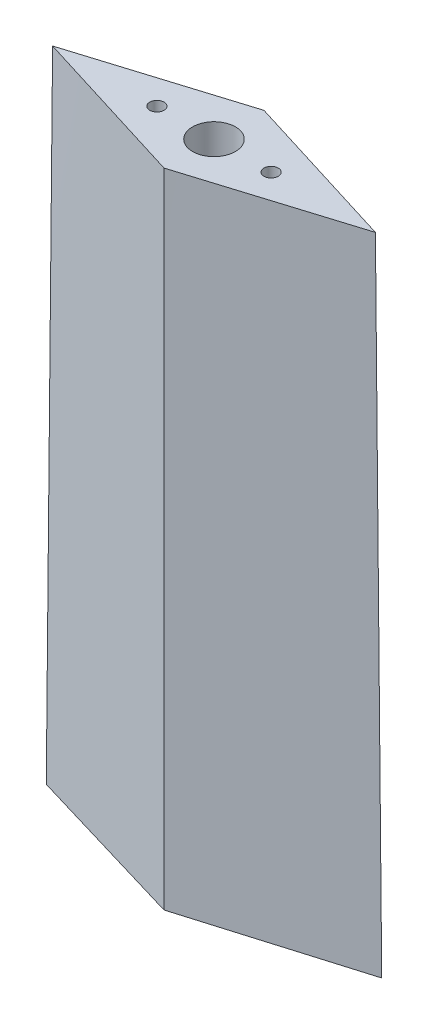
ISO-10303-21;
HEADER;
FILE_DESCRIPTION(('STEP AP214'),'2;1');
FILE_NAME('part.step','',(''),(''),'','','');
FILE_SCHEMA(('AUTOMOTIVE_DESIGN { 1 0 10303 214 1 1 1 1 }'));
ENDSEC;
DATA;
#1=APPLICATION_CONTEXT('core data for automotive mechanical design processes');
#2=APPLICATION_PROTOCOL_DEFINITION('international standard','automotive_design',2000,#1);
#3=PRODUCT_CONTEXT('',#1,'mechanical');
#4=PRODUCT('Part','Part','',(#3));
#5=PRODUCT_RELATED_PRODUCT_CATEGORY('part','',(#4));
#6=PRODUCT_DEFINITION_FORMATION('','',#4);
#7=PRODUCT_DEFINITION_CONTEXT('part definition',#1,'design');
#8=PRODUCT_DEFINITION('design','',#6,#7);
#9=PRODUCT_DEFINITION_SHAPE('','',#8);
#10=(LENGTH_UNIT() NAMED_UNIT(*) SI_UNIT(.MILLI.,.METRE.));
#11=(NAMED_UNIT(*) PLANE_ANGLE_UNIT() SI_UNIT($,.RADIAN.));
#12=(NAMED_UNIT(*) SI_UNIT($,.STERADIAN.) SOLID_ANGLE_UNIT());
#13=UNCERTAINTY_MEASURE_WITH_UNIT(LENGTH_MEASURE(1.E-05),#10,'distance_accuracy_value','');
#14=(GEOMETRIC_REPRESENTATION_CONTEXT(3) GLOBAL_UNCERTAINTY_ASSIGNED_CONTEXT((#13)) GLOBAL_UNIT_ASSIGNED_CONTEXT((#10,
#11,#12)) REPRESENTATION_CONTEXT('',''));
#15=CARTESIAN_POINT('',(0.,0.,0.));
#16=DIRECTION('',(0.,0.,1.));
#17=DIRECTION('',(1.,0.,0.));
#18=AXIS2_PLACEMENT_3D('',#15,#16,#17);
#19=CARTESIAN_POINT('',(219.716026671538,465.168027231046,0.));
#20=CARTESIAN_POINT('',(213.502471629307,1096.96763455169,0.));
#21=CARTESIAN_POINT('',(213.274793673085,465.168027231046,1.85208333333331));
#22=CARTESIAN_POINT('',(208.096831137892,1096.96763455169,1.85208333333331));
#23=CARTESIAN_POINT('',(206.833560674631,465.168027231046,3.70416666666664));
#24=CARTESIAN_POINT('',(202.691190646477,1096.96763455169,3.70416666666663));
#25=CARTESIAN_POINT('',(193.951094677724,465.168027231046,7.4083333333333));
#26=CARTESIAN_POINT('',(191.879909663647,1096.96763455169,7.4083333333333));
#27=CARTESIAN_POINT('',(187.509861679271,465.168027231046,9.26041666666665));
#28=CARTESIAN_POINT('',(186.474269172232,1096.96763455169,9.26041666666665));
#29=CARTESIAN_POINT('',(181.068628680817,465.168027231046,11.1125));
#30=CARTESIAN_POINT('',(181.068628680817,1096.96763455169,11.1125));
#31=B_SPLINE_SURFACE_WITH_KNOTS('',3,1,((#19,#20),(#21,#22),(#23,#24),(#25,#26),(#27,#28),(#29,
#30)),.UNSPECIFIED.,.F.,.F.,.F.,(4,2,4),(2,2),(0.,0.5,1.),(0.,1.),.UNSPECIFIED.);
#32=CARTESIAN_POINT('',(181.068628680817,745.712215652406,11.1125));
#33=CARTESIAN_POINT('',(184.269788718265,745.712215652406,10.1212895187487));
#34=CARTESIAN_POINT('',(187.470948755713,745.712215652406,9.13007903749738));
#35=CARTESIAN_POINT('',(193.873268830608,745.712215652406,7.14765807499477));
#36=CARTESIAN_POINT('',(197.074428868056,745.712215652406,6.15644759374346));
#37=CARTESIAN_POINT('',(205.836046191891,745.712215652406,3.44349140832811));
#38=CARTESIAN_POINT('',(211.396503478278,745.712215652406,1.72174570416407));
#39=CARTESIAN_POINT('',(216.956960764665,745.712215652406,0.));
#40=B_SPLINE_CURVE_WITH_KNOTS('',3,(#32,#33,#34,#35,#36,#37,#38,#39),.UNSPECIFIED.,.F.,.F.,(4,2,
2,4),(0.,10.0533235415682,20.1066470831364,37.5694029232634),.UNSPECIFIED.);
#41=CARTESIAN_POINT('',(181.068628680817,745.712215652406,11.1125));
#42=VERTEX_POINT('',#41);
#43=CARTESIAN_POINT('',(216.956960764665,745.712215652406,0.));
#44=VERTEX_POINT('',#43);
#45=EDGE_CURVE('E119',#42,#44,#40,.T.);
#46=DIRECTION('',(0.,1.,0.));
#47=VECTOR('',#46,1.);
#48=CARTESIAN_POINT('',(181.068628680817,781.067830891368,11.1125));
#49=LINE('',#48,#47);
#50=CARTESIAN_POINT('',(181.068628680817,602.837215652406,11.1125));
#51=VERTEX_POINT('',#50);
#52=EDGE_CURVE('E73',#51,#42,#49,.T.);
#53=CARTESIAN_POINT('',(218.362092496898,602.837215652406,0.));
#54=CARTESIAN_POINT('',(215.15052846194,602.837215652406,0.956964081279098));
#55=CARTESIAN_POINT('',(211.938964426982,602.837215652406,1.9139281625582));
#56=CARTESIAN_POINT('',(205.515836357066,602.837215652406,3.82785632511641));
#57=CARTESIAN_POINT('',(202.304272322108,602.837215652406,4.78482040639551));
#58=CARTESIAN_POINT('',(193.084681751706,602.837215652406,7.53202299178308));
#59=CARTESIAN_POINT('',(187.076655216262,602.837215652406,9.32226149589155));
#60=CARTESIAN_POINT('',(181.068628680818,602.837215652406,11.1125));
#61=B_SPLINE_CURVE_WITH_KNOTS('',3,(#53,#54,#55,#56,#57,#58,#59,#60),.UNSPECIFIED.,.F.,.F.,(4,2,
2,4),(0.,10.0533235415682,20.1066470831364,38.9138805524626),.UNSPECIFIED.);
#62=CARTESIAN_POINT('',(218.362092496898,602.837215652406,0.));
#63=VERTEX_POINT('',#62);
#64=EDGE_CURVE('E125',#63,#51,#61,.T.);
#65=DIRECTION('',(-0.00983421721197636,0.99995164291671,0.));
#66=VECTOR('',#65,1.);
#67=CARTESIAN_POINT('',(219.716026671538,465.168027231046,0.));
#68=LINE('',#67,#66);
#69=EDGE_CURVE('E12',#63,#44,#68,.T.);
#70=ORIENTED_EDGE('',*,*,#45,.F.);
#71=ORIENTED_EDGE('',*,*,#52,.F.);
#72=ORIENTED_EDGE('',*,*,#64,.F.);
#73=ORIENTED_EDGE('',*,*,#69,.T.);
#74=EDGE_LOOP('',(#70,#71,#72,#73));
#75=FACE_BOUND('',#74,.T.);
#76=ADVANCED_FACE('F61',(#75),#31,.F.);
#77=CARTESIAN_POINT('',(181.068628680817,465.168027231046,11.1125));
#78=CARTESIAN_POINT('',(181.068628680817,1096.96763455169,11.1125));
#79=CARTESIAN_POINT('',(174.627395682364,465.168027231046,9.26041666666668));
#80=CARTESIAN_POINT('',(175.662988189402,1096.96763455169,9.26041666666663));
#81=CARTESIAN_POINT('',(168.186162683911,465.168027231046,7.40833333333335));
#82=CARTESIAN_POINT('',(170.257347697988,1096.96763455169,7.40833333333328));
#83=CARTESIAN_POINT('',(155.303696687004,465.168027231046,3.70416666666668));
#84=CARTESIAN_POINT('',(159.446066715158,1096.96763455169,3.70416666666661));
#85=CARTESIAN_POINT('',(148.86246368855,465.168027231046,1.85208333333334));
#86=CARTESIAN_POINT('',(154.040426223743,1096.96763455169,1.8520833333333));
#87=CARTESIAN_POINT('',(142.421230690097,465.168027231046,0.));
#88=CARTESIAN_POINT('',(148.634785732328,1096.96763455169,0.));
#89=B_SPLINE_SURFACE_WITH_KNOTS('',3,1,((#77,#78),(#79,#80),(#81,#82),(#83,#84),(#85,#86),(#87,
#88)),.UNSPECIFIED.,.F.,.F.,.F.,(4,2,4),(2,2),(0.,0.5,1.),(0.,1.),.UNSPECIFIED.);
#90=CARTESIAN_POINT('',(145.18029659697,745.712215652406,0.));
#91=CARTESIAN_POINT('',(148.381456634418,745.712215652406,0.991210481251291));
#92=CARTESIAN_POINT('',(151.582616671865,745.712215652406,1.98242096250259));
#93=CARTESIAN_POINT('',(157.984936746761,745.712215652406,3.96484192500519));
#94=CARTESIAN_POINT('',(161.186096784208,745.712215652406,4.95605240625649));
#95=CARTESIAN_POINT('',(169.947714108043,745.712215652406,7.66900859167186));
#96=CARTESIAN_POINT('',(175.50817139443,745.712215652406,9.39075429583593));
#97=CARTESIAN_POINT('',(181.068628680817,745.712215652406,11.1125));
#98=B_SPLINE_CURVE_WITH_KNOTS('',3,(#90,#91,#92,#93,#94,#95,#96,#97),.UNSPECIFIED.,.F.,.F.,(4,2,
2,4),(0.,10.0533235415681,20.1066470831362,37.5694029232634),.UNSPECIFIED.);
#99=CARTESIAN_POINT('',(145.18029659697,745.712215652406,0.));
#100=VERTEX_POINT('',#99);
#101=EDGE_CURVE('E107',#100,#42,#98,.T.);
#102=DIRECTION('',(0.00983421721197636,0.99995164291671,0.));
#103=VECTOR('',#102,1.);
#104=CARTESIAN_POINT('',(145.528008211213,781.067830891368,0.));
#105=LINE('',#104,#103);
#106=CARTESIAN_POINT('',(143.775164864737,602.837215652406,0.));
#107=VERTEX_POINT('',#106);
#108=EDGE_CURVE('E117',#107,#100,#105,.T.);
#109=CARTESIAN_POINT('',(181.068628680817,602.837215652406,11.1125));
#110=CARTESIAN_POINT('',(177.857064645859,602.837215652406,10.1555359187209));
#111=CARTESIAN_POINT('',(174.645500610901,602.837215652406,9.19857183744178));
#112=CARTESIAN_POINT('',(168.222372540985,602.837215652406,7.28464367488359));
#113=CARTESIAN_POINT('',(165.010808506027,602.837215652406,6.3276795936045));
#114=CARTESIAN_POINT('',(155.791217935625,602.837215652406,3.58047700821695));
#115=CARTESIAN_POINT('',(149.783191400181,602.837215652406,1.79023850410849));
#116=CARTESIAN_POINT('',(143.775164864737,602.837215652406,0.));
#117=B_SPLINE_CURVE_WITH_KNOTS('',3,(#109,#110,#111,#112,#113,#114,#115,#116),.UNSPECIFIED.,.F.,
.F.,(4,2,2,4),(0.,10.0533235415681,20.1066470831362,38.9138805524626),.UNSPECIFIED.);
#118=EDGE_CURVE('E89',#51,#107,#117,.T.);
#119=ORIENTED_EDGE('',*,*,#101,.F.);
#120=ORIENTED_EDGE('',*,*,#108,.F.);
#121=ORIENTED_EDGE('',*,*,#118,.F.);
#122=ORIENTED_EDGE('',*,*,#52,.T.);
#123=EDGE_LOOP('',(#119,#120,#121,#122));
#124=FACE_BOUND('',#123,.T.);
#125=ADVANCED_FACE('F63',(#124),#89,.F.);
#126=CARTESIAN_POINT('',(219.716026671538,465.168027231046,0.));
#127=CARTESIAN_POINT('',(213.502471629307,1096.96763455169,0.));
#128=CARTESIAN_POINT('',(213.274793673085,465.168027231046,-1.85208333333331));
#129=CARTESIAN_POINT('',(208.096831137892,1096.96763455169,-1.85208333333331));
#130=CARTESIAN_POINT('',(206.833560674631,465.168027231046,-3.70416666666664));
#131=CARTESIAN_POINT('',(202.691190646477,1096.96763455169,-3.70416666666663));
#132=CARTESIAN_POINT('',(193.951094677724,465.168027231046,-7.4083333333333));
#133=CARTESIAN_POINT('',(191.879909663647,1096.96763455169,-7.4083333333333));
#134=CARTESIAN_POINT('',(187.509861679271,465.168027231046,-9.26041666666665));
#135=CARTESIAN_POINT('',(186.474269172232,1096.96763455169,-9.26041666666665));
#136=CARTESIAN_POINT('',(181.068628680817,465.168027231046,-11.1125));
#137=CARTESIAN_POINT('',(181.068628680817,1096.96763455169,-11.1125));
#138=B_SPLINE_SURFACE_WITH_KNOTS('',3,1,((#126,#127),(#128,#129),(#130,#131),(#132,#133),(#134,
#135),(#136,#137)),.UNSPECIFIED.,.F.,.F.,.F.,(4,2,4),(2,2),(0.,0.5,1.),(0.,1.),.UNSPECIFIED.);
#139=CARTESIAN_POINT('',(216.956960764665,745.712215652406,0.));
#140=CARTESIAN_POINT('',(213.755800727217,745.712215652406,-0.991210481251306));
#141=CARTESIAN_POINT('',(210.55464068977,745.712215652406,-1.98242096250261));
#142=CARTESIAN_POINT('',(204.152320614874,745.712215652406,-3.96484192500523));
#143=CARTESIAN_POINT('',(200.951160577427,745.712215652406,-4.95605240625653));
#144=CARTESIAN_POINT('',(192.189543253592,745.712215652406,-7.6690085916719));
#145=CARTESIAN_POINT('',(186.629085967205,745.712215652406,-9.39075429583595));
#146=CARTESIAN_POINT('',(181.068628680817,745.712215652406,-11.1125));
#147=B_SPLINE_CURVE_WITH_KNOTS('',3,(#139,#140,#141,#142,#143,#144,#145,#146),.UNSPECIFIED.,.F.,
.F.,(4,2,2,4),(0.,10.0533235415682,20.1066470831364,37.5694029232635),.UNSPECIFIED.);
#148=CARTESIAN_POINT('',(181.068628680817,745.712215652406,-11.1125));
#149=VERTEX_POINT('',#148);
#150=EDGE_CURVE('E81',#44,#149,#147,.T.);
#151=CARTESIAN_POINT('',(181.068628680817,602.837215652406,-11.1125));
#152=CARTESIAN_POINT('',(184.280192715776,602.837215652406,-10.1555359187209));
#153=CARTESIAN_POINT('',(187.491756750734,602.837215652406,-9.19857183744179));
#154=CARTESIAN_POINT('',(193.91488482065,602.837215652406,-7.28464367488358));
#155=CARTESIAN_POINT('',(197.126448855608,602.837215652406,-6.32767959360448));
#156=CARTESIAN_POINT('',(206.34603942601,602.837215652406,-3.58047700821691));
#157=CARTESIAN_POINT('',(212.354065961454,602.837215652406,-1.79023850410845));
#158=CARTESIAN_POINT('',(218.362092496898,602.837215652406,0.));
#159=B_SPLINE_CURVE_WITH_KNOTS('',3,(#151,#152,#153,#154,#155,#156,#157,#158),.UNSPECIFIED.,.F.,
.F.,(4,2,2,4),(0.,10.0533235415682,20.1066470831363,38.9138805524626),.UNSPECIFIED.);
#160=CARTESIAN_POINT('',(181.068628680817,602.837215652406,-11.1125));
#161=VERTEX_POINT('',#160);
#162=EDGE_CURVE('E169',#161,#63,#159,.T.);
#163=DIRECTION('',(0.,1.,0.));
#164=VECTOR('',#163,1.);
#165=CARTESIAN_POINT('',(181.068628680817,781.067830891368,-11.1125));
#166=LINE('',#165,#164);
#167=EDGE_CURVE('E123',#161,#149,#166,.T.);
#168=ORIENTED_EDGE('',*,*,#150,.F.);
#169=ORIENTED_EDGE('',*,*,#69,.F.);
#170=ORIENTED_EDGE('',*,*,#162,.F.);
#171=ORIENTED_EDGE('',*,*,#167,.T.);
#172=EDGE_LOOP('',(#168,#169,#170,#171));
#173=FACE_BOUND('',#172,.T.);
#174=ADVANCED_FACE('F173',(#173),#138,.T.);
#175=CARTESIAN_POINT('',(181.068628680817,465.168027231046,-11.1125));
#176=CARTESIAN_POINT('',(181.068628680817,1096.96763455169,-11.1125));
#177=CARTESIAN_POINT('',(174.627395682364,465.168027231046,-9.26041666666668));
#178=CARTESIAN_POINT('',(175.662988189402,1096.96763455169,-9.26041666666663));
#179=CARTESIAN_POINT('',(168.186162683911,465.168027231046,-7.40833333333335));
#180=CARTESIAN_POINT('',(170.257347697988,1096.96763455169,-7.40833333333328));
#181=CARTESIAN_POINT('',(155.303696687004,465.168027231046,-3.70416666666668));
#182=CARTESIAN_POINT('',(159.446066715158,1096.96763455169,-3.70416666666661));
#183=CARTESIAN_POINT('',(148.86246368855,465.168027231046,-1.85208333333334));
#184=CARTESIAN_POINT('',(154.040426223743,1096.96763455169,-1.8520833333333));
#185=CARTESIAN_POINT('',(142.421230690097,465.168027231046,0.));
#186=CARTESIAN_POINT('',(148.634785732328,1096.96763455169,0.));
#187=B_SPLINE_SURFACE_WITH_KNOTS('',3,1,((#175,#176),(#177,#178),(#179,#180),(#181,#182),(#183,
#184),(#185,#186)),.UNSPECIFIED.,.F.,.F.,.F.,(4,2,4),(2,2),(0.,0.5,1.),(0.,1.),.UNSPECIFIED.);
#188=CARTESIAN_POINT('',(181.068628680817,745.712215652406,-11.1125));
#189=CARTESIAN_POINT('',(177.86746864337,745.712215652406,-10.1212895187487));
#190=CARTESIAN_POINT('',(174.666308605922,745.712215652406,-9.13007903749739));
#191=CARTESIAN_POINT('',(168.263988531027,745.712215652406,-7.14765807499479));
#192=CARTESIAN_POINT('',(165.062828493579,745.712215652406,-6.15644759374348));
#193=CARTESIAN_POINT('',(156.301211169744,745.712215652406,-3.44349140832812));
#194=CARTESIAN_POINT('',(150.740753883357,745.712215652406,-1.72174570416406));
#195=CARTESIAN_POINT('',(145.18029659697,745.712215652406,0.));
#196=B_SPLINE_CURVE_WITH_KNOTS('',3,(#188,#189,#190,#191,#192,#193,#194,#195),.UNSPECIFIED.,.F.,
.F.,(4,2,2,4),(0.,10.0533235415681,20.1066470831363,37.5694029232634),.UNSPECIFIED.);
#197=EDGE_CURVE('E104',#149,#100,#196,.T.);
#198=CARTESIAN_POINT('',(143.775164864737,602.837215652406,0.));
#199=CARTESIAN_POINT('',(146.986728899695,602.837215652406,-0.956964081279093));
#200=CARTESIAN_POINT('',(150.198292934653,602.837215652406,-1.91392816255819));
#201=CARTESIAN_POINT('',(156.621421004569,602.837215652406,-3.8278563251164));
#202=CARTESIAN_POINT('',(159.832985039527,602.837215652406,-4.7848204063955));
#203=CARTESIAN_POINT('',(169.052575609929,602.837215652406,-7.53202299178308));
#204=CARTESIAN_POINT('',(175.060602145373,602.837215652406,-9.32226149589155));
#205=CARTESIAN_POINT('',(181.068628680818,602.837215652406,-11.1125));
#206=B_SPLINE_CURVE_WITH_KNOTS('',3,(#198,#199,#200,#201,#202,#203,#204,#205),.UNSPECIFIED.,.F.,
.F.,(4,2,2,4),(0.,10.0533235415681,20.1066470831363,38.9138805524626),.UNSPECIFIED.);
#207=EDGE_CURVE('E122',#107,#161,#206,.T.);
#208=ORIENTED_EDGE('',*,*,#197,.F.);
#209=ORIENTED_EDGE('',*,*,#167,.F.);
#210=ORIENTED_EDGE('',*,*,#207,.F.);
#211=ORIENTED_EDGE('',*,*,#108,.T.);
#212=EDGE_LOOP('',(#208,#209,#210,#211));
#213=FACE_BOUND('',#212,.T.);
#214=ADVANCED_FACE('F121',(#213),#187,.T.);
#215=CARTESIAN_POINT('',(181.068628680817,1100.16802723105,0.));
#216=DIRECTION('',(0.,-1.,0.));
#217=DIRECTION('',(0.,0.,-1.));
#218=AXIS2_PLACEMENT_3D('',#215,#216,#217);
#219=CYLINDRICAL_SURFACE('',#218,4.76250000000001);
#220=CARTESIAN_POINT('',(181.068628680817,602.837215652406,0.));
#221=DIRECTION('',(0.,-1.,0.));
#222=DIRECTION('',(0.,0.,-1.));
#223=AXIS2_PLACEMENT_3D('',#220,#221,#222);
#224=CIRCLE('',#223,4.76250000000001);
#225=CARTESIAN_POINT('',(181.068628680817,602.837215652406,-4.76250000000001));
#226=VERTEX_POINT('',#225);
#227=EDGE_CURVE('E129',#226,#226,#224,.F.);
#228=CARTESIAN_POINT('',(181.068628680817,745.712215652406,0.));
#229=DIRECTION('',(0.,1.,0.));
#230=DIRECTION('',(0.,0.,1.));
#231=AXIS2_PLACEMENT_3D('',#228,#229,#230);
#232=CIRCLE('',#231,4.76250000000001);
#233=CARTESIAN_POINT('',(181.068628680817,745.712215652406,-4.76250000000001));
#234=VERTEX_POINT('',#233);
#235=EDGE_CURVE('E68',#234,#234,#232,.F.);
#236=CARTESIAN_POINT('',(181.068628680817,602.837215652406,-4.76250000000001));
#237=CARTESIAN_POINT('',(181.068628680817,604.325496902406,-4.76250000000001));
#238=CARTESIAN_POINT('',(181.068628680817,605.813778152406,-4.76250000000001));
#239=CARTESIAN_POINT('',(181.068628680817,608.790340652406,-4.76250000000001));
#240=CARTESIAN_POINT('',(181.068628680817,610.278621902406,-4.76250000000001));
#241=CARTESIAN_POINT('',(181.068628680817,613.255184402406,-4.76250000000001));
#242=CARTESIAN_POINT('',(181.068628680817,614.743465652406,-4.76250000000001));
#243=CARTESIAN_POINT('',(181.068628680817,617.720028152406,-4.76250000000001));
#244=CARTESIAN_POINT('',(181.068628680817,619.208309402406,-4.76250000000001));
#245=CARTESIAN_POINT('',(181.068628680817,622.184871902406,-4.76250000000001));
#246=CARTESIAN_POINT('',(181.068628680817,623.673153152406,-4.76250000000001));
#247=CARTESIAN_POINT('',(181.068628680817,626.649715652406,-4.76250000000001));
#248=CARTESIAN_POINT('',(181.068628680817,628.137996902406,-4.76250000000001));
#249=CARTESIAN_POINT('',(181.068628680817,631.114559402406,-4.76250000000001));
#250=CARTESIAN_POINT('',(181.068628680817,632.602840652406,-4.76250000000001));
#251=CARTESIAN_POINT('',(181.068628680817,635.579403152406,-4.76250000000001));
#252=CARTESIAN_POINT('',(181.068628680817,637.067684402406,-4.76250000000001));
#253=CARTESIAN_POINT('',(181.068628680817,640.044246902406,-4.76250000000001));
#254=CARTESIAN_POINT('',(181.068628680817,641.532528152406,-4.76250000000001));
#255=CARTESIAN_POINT('',(181.068628680817,644.509090652406,-4.76250000000001));
#256=CARTESIAN_POINT('',(181.068628680817,645.997371902406,-4.76250000000001));
#257=CARTESIAN_POINT('',(181.068628680817,648.973934402406,-4.76250000000001));
#258=CARTESIAN_POINT('',(181.068628680817,650.462215652406,-4.76250000000001));
#259=CARTESIAN_POINT('',(181.068628680817,653.438778152406,-4.76250000000001));
#260=CARTESIAN_POINT('',(181.068628680817,654.927059402406,-4.76250000000001));
#261=CARTESIAN_POINT('',(181.068628680817,657.903621902406,-4.76250000000001));
#262=CARTESIAN_POINT('',(181.068628680817,659.391903152406,-4.76250000000001));
#263=CARTESIAN_POINT('',(181.068628680817,662.368465652406,-4.76250000000001));
#264=CARTESIAN_POINT('',(181.068628680817,663.856746902406,-4.76250000000001));
#265=CARTESIAN_POINT('',(181.068628680817,666.833309402406,-4.76250000000001));
#266=CARTESIAN_POINT('',(181.068628680817,668.321590652406,-4.76250000000001));
#267=CARTESIAN_POINT('',(181.068628680817,671.298153152406,-4.76250000000001));
#268=CARTESIAN_POINT('',(181.068628680817,672.786434402406,-4.76250000000001));
#269=CARTESIAN_POINT('',(181.068628680817,675.762996902406,-4.76250000000001));
#270=CARTESIAN_POINT('',(181.068628680817,677.251278152406,-4.76250000000001));
#271=CARTESIAN_POINT('',(181.068628680817,680.227840652406,-4.76250000000001));
#272=CARTESIAN_POINT('',(181.068628680817,681.716121902406,-4.76250000000001));
#273=CARTESIAN_POINT('',(181.068628680817,684.692684402406,-4.76250000000001));
#274=CARTESIAN_POINT('',(181.068628680817,686.180965652406,-4.76250000000001));
#275=CARTESIAN_POINT('',(181.068628680817,689.157528152406,-4.76250000000001));
#276=CARTESIAN_POINT('',(181.068628680817,690.645809402406,-4.76250000000001));
#277=CARTESIAN_POINT('',(181.068628680817,693.622371902406,-4.76250000000001));
#278=CARTESIAN_POINT('',(181.068628680817,695.110653152406,-4.76250000000001));
#279=CARTESIAN_POINT('',(181.068628680817,698.087215652406,-4.76250000000001));
#280=CARTESIAN_POINT('',(181.068628680817,699.575496902406,-4.76250000000001));
#281=CARTESIAN_POINT('',(181.068628680817,702.552059402406,-4.76250000000001));
#282=CARTESIAN_POINT('',(181.068628680817,704.040340652406,-4.76250000000001));
#283=CARTESIAN_POINT('',(181.068628680817,707.016903152406,-4.76250000000001));
#284=CARTESIAN_POINT('',(181.068628680817,708.505184402406,-4.76250000000001));
#285=CARTESIAN_POINT('',(181.068628680817,711.481746902406,-4.76250000000001));
#286=CARTESIAN_POINT('',(181.068628680817,712.970028152406,-4.76250000000001));
#287=CARTESIAN_POINT('',(181.068628680817,715.946590652406,-4.76250000000001));
#288=CARTESIAN_POINT('',(181.068628680817,717.434871902406,-4.76250000000001));
#289=CARTESIAN_POINT('',(181.068628680817,720.411434402406,-4.76250000000001));
#290=CARTESIAN_POINT('',(181.068628680817,721.899715652406,-4.76250000000001));
#291=CARTESIAN_POINT('',(181.068628680817,724.876278152406,-4.76250000000001));
#292=CARTESIAN_POINT('',(181.068628680817,726.364559402406,-4.76250000000001));
#293=CARTESIAN_POINT('',(181.068628680817,729.341121902406,-4.76250000000001));
#294=CARTESIAN_POINT('',(181.068628680817,730.829403152406,-4.76250000000001));
#295=CARTESIAN_POINT('',(181.068628680817,733.805965652406,-4.76250000000001));
#296=CARTESIAN_POINT('',(181.068628680817,735.294246902406,-4.76250000000001));
#297=CARTESIAN_POINT('',(181.068628680817,738.270809402406,-4.76250000000001));
#298=CARTESIAN_POINT('',(181.068628680817,739.759090652406,-4.76250000000001));
#299=CARTESIAN_POINT('',(181.068628680817,742.735653152406,-4.76250000000001));
#300=CARTESIAN_POINT('',(181.068628680817,744.223934402406,-4.76250000000001));
#301=CARTESIAN_POINT('',(181.068628680817,745.712215652406,-4.76250000000001));
#302=B_SPLINE_CURVE_WITH_KNOTS('',3,(#236,#237,#238,#239,#240,#241,#242,#243,#244,#245,#246,
#247,#248,#249,#250,#251,#252,#253,#254,#255,#256,#257,#258,#259,#260,#261,#262,#263,#264,#265,
#266,#267,#268,#269,#270,#271,#272,#273,#274,#275,#276,#277,#278,#279,#280,#281,#282,#283,#284,
#285,#286,#287,#288,#289,#290,#291,#292,#293,#294,#295,#296,#297,#298,#299,#300,#301),
.UNSPECIFIED.,.F.,.F.,(4,2,2,2,2,2,2,2,2,2,2,2,2,2,2,2,2,2,2,2,2,2,2,2,2,2,2,2,2,2,2,2,4),(0.,
4.46484374999989,8.92968750000001,13.3945312499999,17.859375,22.3242187499999,26.7890624999999,
31.2539062499999,35.7187499999999,40.1835937499999,44.6484374999999,49.1132812499999,
53.5781249999998,58.0429687499999,62.5078124999998,66.9726562499999,71.4374999999998,
75.9023437499999,80.3671874999998,84.8320312499999,89.2968749999998,93.7617187499999,
98.2265624999998,102.69140625,107.15625,111.62109375,116.0859375,120.55078125,125.015625,
129.48046875,133.9453125,138.41015625,142.875),.UNSPECIFIED.);
#303=EDGE_CURVE('BSEAM156',#226,#234,#302,.T.);
#304=ORIENTED_EDGE('',*,*,#227,.F.);
#305=ORIENTED_EDGE('',*,*,#235,.F.);
#306=ORIENTED_EDGE('',*,*,#303,.T.);
#307=ORIENTED_EDGE('',*,*,#303,.F.);
#308=EDGE_LOOP('',(#304,#306,#305,#307));
#309=FACE_BOUND('',#308,.T.);
#310=ADVANCED_FACE('F156',(#309),#219,.F.);
#311=CARTESIAN_POINT('',(0.,602.837215652406,-11.1126));
#312=DIRECTION('',(0.,-1.,0.));
#313=DIRECTION('',(0.,0.,-1.));
#314=AXIS2_PLACEMENT_3D('',#311,#312,#313);
#315=PLANE('',#314);
#316=CARTESIAN_POINT('',(193.768628680817,602.837215652406,0.));
#317=DIRECTION('',(0.,-1.,0.));
#318=DIRECTION('',(0.,0.,-1.));
#319=AXIS2_PLACEMENT_3D('',#316,#317,#318);
#320=CIRCLE('',#319,1.58749999999999);
#321=CARTESIAN_POINT('',(193.768628680817,602.837215652406,-1.58749999999999));
#322=VERTEX_POINT('',#321);
#323=EDGE_CURVE('E341',#322,#322,#320,.T.);
#324=ORIENTED_EDGE('',*,*,#323,.F.);
#325=EDGE_LOOP('',(#324));
#326=FACE_BOUND('',#325,.T.);
#327=CARTESIAN_POINT('',(168.368628680817,602.837215652406,0.));
#328=DIRECTION('',(0.,-1.,0.));
#329=DIRECTION('',(0.,0.,-1.));
#330=AXIS2_PLACEMENT_3D('',#327,#328,#329);
#331=CIRCLE('',#330,1.58749999999999);
#332=CARTESIAN_POINT('',(168.368628680817,602.837215652406,-1.58749999999999));
#333=VERTEX_POINT('',#332);
#334=EDGE_CURVE('E340',#333,#333,#331,.T.);
#335=ORIENTED_EDGE('',*,*,#334,.F.);
#336=EDGE_LOOP('',(#335));
#337=FACE_BOUND('',#336,.T.);
#338=ORIENTED_EDGE('',*,*,#227,.T.);
#339=EDGE_LOOP('',(#338));
#340=FACE_BOUND('',#339,.T.);
#341=ORIENTED_EDGE('',*,*,#64,.T.);
#342=ORIENTED_EDGE('',*,*,#118,.T.);
#343=ORIENTED_EDGE('',*,*,#207,.T.);
#344=ORIENTED_EDGE('',*,*,#162,.T.);
#345=EDGE_LOOP('',(#341,#342,#343,#344));
#346=FACE_BOUND('',#345,.T.);
#347=ADVANCED_FACE('F151',(#326,#337,#340,#346),#315,.T.);
#348=CARTESIAN_POINT('',(0.,745.712215652406,-11.1126));
#349=DIRECTION('',(0.,1.,0.));
#350=DIRECTION('',(0.,0.,1.));
#351=AXIS2_PLACEMENT_3D('',#348,#349,#350);
#352=PLANE('',#351);
#353=CARTESIAN_POINT('',(193.768628680817,745.712215652406,0.));
#354=DIRECTION('',(0.,1.,0.));
#355=DIRECTION('',(0.,0.,1.));
#356=AXIS2_PLACEMENT_3D('',#353,#354,#355);
#357=CIRCLE('',#356,1.58749999999999);
#358=CARTESIAN_POINT('',(193.768628680817,745.712215652406,1.58749999999999));
#359=VERTEX_POINT('',#358);
#360=EDGE_CURVE('E350',#359,#359,#357,.T.);
#361=ORIENTED_EDGE('',*,*,#360,.F.);
#362=EDGE_LOOP('',(#361));
#363=FACE_BOUND('',#362,.T.);
#364=CARTESIAN_POINT('',(168.368628680817,745.712215652406,0.));
#365=DIRECTION('',(0.,1.,0.));
#366=DIRECTION('',(0.,0.,1.));
#367=AXIS2_PLACEMENT_3D('',#364,#365,#366);
#368=CIRCLE('',#367,1.58749999999999);
#369=CARTESIAN_POINT('',(168.368628680817,745.712215652406,1.58749999999999));
#370=VERTEX_POINT('',#369);
#371=EDGE_CURVE('E355',#370,#370,#368,.T.);
#372=ORIENTED_EDGE('',*,*,#371,.F.);
#373=EDGE_LOOP('',(#372));
#374=FACE_BOUND('',#373,.T.);
#375=ORIENTED_EDGE('',*,*,#235,.T.);
#376=EDGE_LOOP('',(#375));
#377=FACE_BOUND('',#376,.T.);
#378=ORIENTED_EDGE('',*,*,#45,.T.);
#379=ORIENTED_EDGE('',*,*,#150,.T.);
#380=ORIENTED_EDGE('',*,*,#197,.T.);
#381=ORIENTED_EDGE('',*,*,#101,.T.);
#382=EDGE_LOOP('',(#378,#379,#380,#381));
#383=FACE_BOUND('',#382,.T.);
#384=ADVANCED_FACE('F106',(#363,#374,#377,#383),#352,.T.);
#385=CARTESIAN_POINT('',(168.368628680817,733.012215652406,0.));
#386=DIRECTION('',(0.,1.,0.));
#387=DIRECTION('',(0.,0.,1.));
#388=AXIS2_PLACEMENT_3D('',#385,#386,#387);
#389=CYLINDRICAL_SURFACE('',#388,1.58749999999999);
#390=CARTESIAN_POINT('',(168.368628680817,733.012215652406,0.));
#391=DIRECTION('',(0.,1.,0.));
#392=DIRECTION('',(0.,0.,1.));
#393=AXIS2_PLACEMENT_3D('',#390,#391,#392);
#394=CIRCLE('',#393,1.58749999999999);
#395=CARTESIAN_POINT('',(168.368628680817,733.012215652406,1.58749999999999));
#396=VERTEX_POINT('',#395);
#397=EDGE_CURVE('E358',#396,#396,#394,.T.);
#398=ORIENTED_EDGE('',*,*,#397,.F.);
#399=EDGE_LOOP('',(#398));
#400=FACE_BOUND('',#399,.T.);
#401=ORIENTED_EDGE('',*,*,#371,.T.);
#402=EDGE_LOOP('',(#401));
#403=FACE_BOUND('',#402,.T.);
#404=ADVANCED_FACE('F242',(#400,#403),#389,.F.);
#405=CARTESIAN_POINT('',(168.368628680817,733.012215652406,0.));
#406=DIRECTION('',(0.,1.,0.));
#407=DIRECTION('',(0.,0.,1.));
#408=AXIS2_PLACEMENT_3D('',#405,#406,#407);
#409=PLANE('',#408);
#410=ORIENTED_EDGE('',*,*,#397,.T.);
#411=EDGE_LOOP('',(#410));
#412=FACE_BOUND('',#411,.T.);
#413=ADVANCED_FACE('F249',(#412),#409,.T.);
#414=CARTESIAN_POINT('',(193.768628680817,733.012215652406,0.));
#415=DIRECTION('',(0.,1.,0.));
#416=DIRECTION('',(0.,0.,1.));
#417=AXIS2_PLACEMENT_3D('',#414,#415,#416);
#418=CYLINDRICAL_SURFACE('',#417,1.58749999999999);
#419=CARTESIAN_POINT('',(193.768628680817,733.012215652406,0.));
#420=DIRECTION('',(0.,1.,0.));
#421=DIRECTION('',(0.,0.,1.));
#422=AXIS2_PLACEMENT_3D('',#419,#420,#421);
#423=CIRCLE('',#422,1.58749999999999);
#424=CARTESIAN_POINT('',(193.768628680817,733.012215652406,1.58749999999999));
#425=VERTEX_POINT('',#424);
#426=EDGE_CURVE('E352',#425,#425,#423,.T.);
#427=ORIENTED_EDGE('',*,*,#426,.F.);
#428=EDGE_LOOP('',(#427));
#429=FACE_BOUND('',#428,.T.);
#430=ORIENTED_EDGE('',*,*,#360,.T.);
#431=EDGE_LOOP('',(#430));
#432=FACE_BOUND('',#431,.T.);
#433=ADVANCED_FACE('F256',(#429,#432),#418,.F.);
#434=CARTESIAN_POINT('',(193.768628680817,733.012215652406,0.));
#435=DIRECTION('',(0.,1.,0.));
#436=DIRECTION('',(0.,0.,1.));
#437=AXIS2_PLACEMENT_3D('',#434,#435,#436);
#438=PLANE('',#437);
#439=ORIENTED_EDGE('',*,*,#426,.T.);
#440=EDGE_LOOP('',(#439));
#441=FACE_BOUND('',#440,.T.);
#442=ADVANCED_FACE('F264',(#441),#438,.T.);
#443=CARTESIAN_POINT('',(168.368628680817,615.537215652406,0.));
#444=DIRECTION('',(0.,-1.,0.));
#445=DIRECTION('',(0.,0.,-1.));
#446=AXIS2_PLACEMENT_3D('',#443,#444,#445);
#447=CYLINDRICAL_SURFACE('',#446,1.58749999999999);
#448=CARTESIAN_POINT('',(168.368628680817,615.537215652406,0.));
#449=DIRECTION('',(0.,-1.,0.));
#450=DIRECTION('',(0.,0.,-1.));
#451=AXIS2_PLACEMENT_3D('',#448,#449,#450);
#452=CIRCLE('',#451,1.58749999999999);
#453=CARTESIAN_POINT('',(168.368628680817,615.537215652406,-1.58749999999999));
#454=VERTEX_POINT('',#453);
#455=EDGE_CURVE('E344',#454,#454,#452,.T.);
#456=ORIENTED_EDGE('',*,*,#455,.F.);
#457=EDGE_LOOP('',(#456));
#458=FACE_BOUND('',#457,.T.);
#459=ORIENTED_EDGE('',*,*,#334,.T.);
#460=EDGE_LOOP('',(#459));
#461=FACE_BOUND('',#460,.T.);
#462=ADVANCED_FACE('F271',(#458,#461),#447,.F.);
#463=CARTESIAN_POINT('',(168.368628680817,615.537215652406,0.));
#464=DIRECTION('',(0.,-1.,0.));
#465=DIRECTION('',(0.,0.,-1.));
#466=AXIS2_PLACEMENT_3D('',#463,#464,#465);
#467=PLANE('',#466);
#468=ORIENTED_EDGE('',*,*,#455,.T.);
#469=EDGE_LOOP('',(#468));
#470=FACE_BOUND('',#469,.T.);
#471=ADVANCED_FACE('F278',(#470),#467,.T.);
#472=CARTESIAN_POINT('',(193.768628680817,615.537215652406,0.));
#473=DIRECTION('',(0.,-1.,0.));
#474=DIRECTION('',(0.,0.,-1.));
#475=AXIS2_PLACEMENT_3D('',#472,#473,#474);
#476=CYLINDRICAL_SURFACE('',#475,1.58749999999999);
#477=CARTESIAN_POINT('',(193.768628680817,615.537215652406,0.));
#478=DIRECTION('',(0.,-1.,0.));
#479=DIRECTION('',(0.,0.,-1.));
#480=AXIS2_PLACEMENT_3D('',#477,#478,#479);
#481=CIRCLE('',#480,1.58749999999999);
#482=CARTESIAN_POINT('',(193.768628680817,615.537215652406,-1.58749999999999));
#483=VERTEX_POINT('',#482);
#484=EDGE_CURVE('E339',#483,#483,#481,.T.);
#485=ORIENTED_EDGE('',*,*,#484,.F.);
#486=EDGE_LOOP('',(#485));
#487=FACE_BOUND('',#486,.T.);
#488=ORIENTED_EDGE('',*,*,#323,.T.);
#489=EDGE_LOOP('',(#488));
#490=FACE_BOUND('',#489,.T.);
#491=ADVANCED_FACE('F286',(#487,#490),#476,.F.);
#492=CARTESIAN_POINT('',(193.768628680817,615.537215652406,0.));
#493=DIRECTION('',(0.,-1.,0.));
#494=DIRECTION('',(0.,0.,-1.));
#495=AXIS2_PLACEMENT_3D('',#492,#493,#494);
#496=PLANE('',#495);
#497=ORIENTED_EDGE('',*,*,#484,.T.);
#498=EDGE_LOOP('',(#497));
#499=FACE_BOUND('',#498,.T.);
#500=ADVANCED_FACE('F294',(#499),#496,.T.);
#501=CLOSED_SHELL('',(#76,#125,#174,#214,#310,#347,#384,#404,#413,#433,#442,#462,#471,#491,#500));
#502=MANIFOLD_SOLID_BREP('B2',#501);
#503=ADVANCED_BREP_SHAPE_REPRESENTATION('',(#18,#502),#14);
#504=SHAPE_DEFINITION_REPRESENTATION(#9,#503);
ENDSEC;
END-ISO-10303-21;
